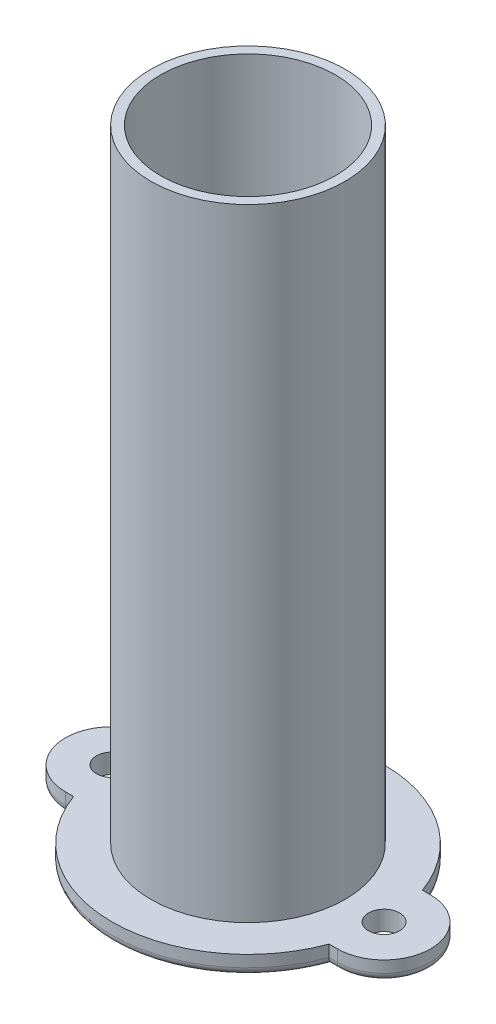
ISO-10303-21;
HEADER;
FILE_DESCRIPTION(('STEP AP214'),'2;1');
FILE_NAME('part.step','',(''),(''),'','','');
FILE_SCHEMA(('AUTOMOTIVE_DESIGN { 1 0 10303 214 1 1 1 1 }'));
ENDSEC;
DATA;
#1=APPLICATION_CONTEXT('core data for automotive mechanical design processes');
#2=APPLICATION_PROTOCOL_DEFINITION('international standard','automotive_design',2000,#1);
#3=PRODUCT_CONTEXT('',#1,'mechanical');
#4=PRODUCT('Part','Part','',(#3));
#5=PRODUCT_RELATED_PRODUCT_CATEGORY('part','',(#4));
#6=PRODUCT_DEFINITION_FORMATION('','',#4);
#7=PRODUCT_DEFINITION_CONTEXT('part definition',#1,'design');
#8=PRODUCT_DEFINITION('design','',#6,#7);
#9=PRODUCT_DEFINITION_SHAPE('','',#8);
#10=(LENGTH_UNIT() NAMED_UNIT(*) SI_UNIT(.MILLI.,.METRE.));
#11=(NAMED_UNIT(*) PLANE_ANGLE_UNIT() SI_UNIT($,.RADIAN.));
#12=(NAMED_UNIT(*) SI_UNIT($,.STERADIAN.) SOLID_ANGLE_UNIT());
#13=UNCERTAINTY_MEASURE_WITH_UNIT(LENGTH_MEASURE(1.E-05),#10,'distance_accuracy_value','');
#14=(GEOMETRIC_REPRESENTATION_CONTEXT(3) GLOBAL_UNCERTAINTY_ASSIGNED_CONTEXT((#13)) GLOBAL_UNIT_ASSIGNED_CONTEXT((#10,
#11,#12)) REPRESENTATION_CONTEXT('',''));
#15=CARTESIAN_POINT('',(0.,0.,0.));
#16=DIRECTION('',(0.,0.,1.));
#17=DIRECTION('',(1.,0.,0.));
#18=AXIS2_PLACEMENT_3D('',#15,#16,#17);
#19=CARTESIAN_POINT('',(-17.5,2.5,0.));
#20=DIRECTION('',(0.,1.,0.));
#21=DIRECTION('',(0.,0.,1.));
#22=AXIS2_PLACEMENT_3D('',#19,#20,#21);
#23=PLANE('',#22);
#24=CARTESIAN_POINT('',(0.,2.5,0.));
#25=DIRECTION('',(0.,1.,0.));
#26=DIRECTION('',(0.,0.,1.));
#27=AXIS2_PLACEMENT_3D('',#24,#25,#26);
#28=CIRCLE('',#27,12.5);
#29=CARTESIAN_POINT('',(0.,2.5,12.5));
#30=VERTEX_POINT('',#29);
#31=EDGE_CURVE('E293',#30,#30,#28,.T.);
#32=ORIENTED_EDGE('',*,*,#31,.F.);
#33=EDGE_LOOP('',(#32));
#34=FACE_BOUND('',#33,.T.);
#35=CARTESIAN_POINT('',(-17.5,2.5,0.));
#36=DIRECTION('',(0.,1.,0.));
#37=DIRECTION('',(0.,0.,1.));
#38=AXIS2_PLACEMENT_3D('',#35,#36,#37);
#39=CIRCLE('',#38,6.);
#40=CARTESIAN_POINT('',(-17.5,2.5,-6.));
#41=VERTEX_POINT('',#40);
#42=CARTESIAN_POINT('',(-17.5,2.5,6.));
#43=VERTEX_POINT('',#42);
#44=EDGE_CURVE('E147',#41,#43,#39,.T.);
#45=ORIENTED_EDGE('',*,*,#44,.T.);
#46=DIRECTION('',(1.,0.,0.));
#47=VECTOR('',#46,1.);
#48=CARTESIAN_POINT('',(-17.5,2.5,6.));
#49=LINE('',#48,#47);
#50=CARTESIAN_POINT('',(-16.4392822227736,2.5,6.));
#51=VERTEX_POINT('',#50);
#52=EDGE_CURVE('E135',#43,#51,#49,.T.);
#53=ORIENTED_EDGE('',*,*,#52,.T.);
#54=CARTESIAN_POINT('',(0.,2.5,0.));
#55=DIRECTION('',(0.,1.,0.));
#56=DIRECTION('',(0.,0.,1.));
#57=AXIS2_PLACEMENT_3D('',#54,#55,#56);
#58=CIRCLE('',#57,17.5);
#59=CARTESIAN_POINT('',(16.4392822227736,2.5,5.99999999999999));
#60=VERTEX_POINT('',#59);
#61=EDGE_CURVE('E146',#51,#60,#58,.T.);
#62=ORIENTED_EDGE('',*,*,#61,.T.);
#63=DIRECTION('',(1.,0.,0.));
#64=VECTOR('',#63,1.);
#65=CARTESIAN_POINT('',(17.5,2.5,5.99999999999999));
#66=LINE('',#65,#64);
#67=CARTESIAN_POINT('',(17.5,2.5,5.99999999999999));
#68=VERTEX_POINT('',#67);
#69=EDGE_CURVE('E351',#60,#68,#66,.T.);
#70=ORIENTED_EDGE('',*,*,#69,.T.);
#71=CARTESIAN_POINT('',(17.5,2.5,0.));
#72=DIRECTION('',(0.,1.,0.));
#73=DIRECTION('',(0.,0.,-1.));
#74=AXIS2_PLACEMENT_3D('',#71,#72,#73);
#75=CIRCLE('',#74,6.);
#76=CARTESIAN_POINT('',(17.5,2.5,-6.));
#77=VERTEX_POINT('',#76);
#78=EDGE_CURVE('E357',#68,#77,#75,.T.);
#79=ORIENTED_EDGE('',*,*,#78,.T.);
#80=DIRECTION('',(-1.,0.,0.));
#81=VECTOR('',#80,1.);
#82=CARTESIAN_POINT('',(17.5,2.5,-6.));
#83=LINE('',#82,#81);
#84=CARTESIAN_POINT('',(16.4392822227736,2.5,-6.));
#85=VERTEX_POINT('',#84);
#86=EDGE_CURVE('E362',#77,#85,#83,.T.);
#87=ORIENTED_EDGE('',*,*,#86,.T.);
#88=CARTESIAN_POINT('',(0.,2.5,0.));
#89=DIRECTION('',(0.,1.,0.));
#90=DIRECTION('',(0.,0.,1.));
#91=AXIS2_PLACEMENT_3D('',#88,#89,#90);
#92=CIRCLE('',#91,17.5);
#93=CARTESIAN_POINT('',(-16.4392822227736,2.5,-6.));
#94=VERTEX_POINT('',#93);
#95=EDGE_CURVE('E365',#85,#94,#92,.T.);
#96=ORIENTED_EDGE('',*,*,#95,.T.);
#97=DIRECTION('',(-1.,0.,0.));
#98=VECTOR('',#97,1.);
#99=CARTESIAN_POINT('',(-17.5,2.5,-6.));
#100=LINE('',#99,#98);
#101=EDGE_CURVE('E152',#94,#41,#100,.T.);
#102=ORIENTED_EDGE('',*,*,#101,.T.);
#103=EDGE_LOOP('',(#45,#53,#62,#70,#79,#87,#96,#102));
#104=FACE_BOUND('',#103,.T.);
#105=CARTESIAN_POINT('',(-17.5,2.5,0.));
#106=DIRECTION('',(0.,1.,0.));
#107=DIRECTION('',(0.,0.,1.));
#108=AXIS2_PLACEMENT_3D('',#105,#106,#107);
#109=CIRCLE('',#108,2.);
#110=CARTESIAN_POINT('',(-17.5,2.5,2.));
#111=VERTEX_POINT('',#110);
#112=EDGE_CURVE('E157',#111,#111,#109,.T.);
#113=ORIENTED_EDGE('',*,*,#112,.F.);
#114=EDGE_LOOP('',(#113));
#115=FACE_BOUND('',#114,.T.);
#116=CARTESIAN_POINT('',(17.5,2.5,0.));
#117=DIRECTION('',(0.,1.,0.));
#118=DIRECTION('',(0.,0.,1.));
#119=AXIS2_PLACEMENT_3D('',#116,#117,#118);
#120=CIRCLE('',#119,2.);
#121=CARTESIAN_POINT('',(17.5,2.5,2.));
#122=VERTEX_POINT('',#121);
#123=EDGE_CURVE('E411',#122,#122,#120,.T.);
#124=ORIENTED_EDGE('',*,*,#123,.F.);
#125=EDGE_LOOP('',(#124));
#126=FACE_BOUND('',#125,.T.);
#127=ADVANCED_FACE('F41',(#34,#104,#115,#126),#23,.T.);
#128=CARTESIAN_POINT('',(-17.5,0.,0.));
#129=DIRECTION('',(0.,1.,0.));
#130=DIRECTION('',(0.,0.,1.));
#131=AXIS2_PLACEMENT_3D('',#128,#129,#130);
#132=PLANE('',#131);
#133=CARTESIAN_POINT('',(0.,0.,0.));
#134=DIRECTION('',(0.,1.,0.));
#135=DIRECTION('',(0.,0.,1.));
#136=AXIS2_PLACEMENT_3D('',#133,#134,#135);
#137=CIRCLE('',#136,12.25);
#138=CARTESIAN_POINT('',(0.,0.,12.25));
#139=VERTEX_POINT('',#138);
#140=EDGE_CURVE('E198',#139,#139,#137,.T.);
#141=ORIENTED_EDGE('',*,*,#140,.T.);
#142=EDGE_LOOP('',(#141));
#143=FACE_BOUND('',#142,.T.);
#144=DIRECTION('',(-1.,0.,0.));
#145=VECTOR('',#144,1.);
#146=CARTESIAN_POINT('',(-17.5,0.,-5.));
#147=LINE('',#146,#145);
#148=CARTESIAN_POINT('',(-17.5,0.,-5.));
#149=VERTEX_POINT('',#148);
#150=CARTESIAN_POINT('',(-15.7241851935164,0.,-5.));
#151=VERTEX_POINT('',#150);
#152=EDGE_CURVE('E191',#149,#151,#147,.F.);
#153=ORIENTED_EDGE('',*,*,#152,.T.);
#154=CARTESIAN_POINT('',(0.,0.,0.));
#155=DIRECTION('',(0.,1.,0.));
#156=DIRECTION('',(0.,0.,1.));
#157=AXIS2_PLACEMENT_3D('',#154,#155,#156);
#158=CIRCLE('',#157,16.5);
#159=CARTESIAN_POINT('',(15.7241851935164,0.,-5.));
#160=VERTEX_POINT('',#159);
#161=EDGE_CURVE('E195',#151,#160,#158,.F.);
#162=ORIENTED_EDGE('',*,*,#161,.T.);
#163=DIRECTION('',(-1.,0.,0.));
#164=VECTOR('',#163,1.);
#165=CARTESIAN_POINT('',(-17.5,0.,-5.));
#166=LINE('',#165,#164);
#167=CARTESIAN_POINT('',(17.5,0.,-5.));
#168=VERTEX_POINT('',#167);
#169=EDGE_CURVE('E188',#160,#168,#166,.F.);
#170=ORIENTED_EDGE('',*,*,#169,.T.);
#171=CARTESIAN_POINT('',(17.5,0.,0.));
#172=DIRECTION('',(0.,1.,0.));
#173=DIRECTION('',(0.,0.,1.));
#174=AXIS2_PLACEMENT_3D('',#171,#172,#173);
#175=CIRCLE('',#174,5.);
#176=CARTESIAN_POINT('',(17.5,0.,4.99999999999999));
#177=VERTEX_POINT('',#176);
#178=EDGE_CURVE('E182',#168,#177,#175,.F.);
#179=ORIENTED_EDGE('',*,*,#178,.T.);
#180=DIRECTION('',(1.,0.,0.));
#181=VECTOR('',#180,1.);
#182=CARTESIAN_POINT('',(-17.5,0.,4.99999999999999));
#183=LINE('',#182,#181);
#184=CARTESIAN_POINT('',(15.7241851935164,0.,4.99999999999999));
#185=VERTEX_POINT('',#184);
#186=EDGE_CURVE('E176',#177,#185,#183,.F.);
#187=ORIENTED_EDGE('',*,*,#186,.T.);
#188=CARTESIAN_POINT('',(0.,0.,0.));
#189=DIRECTION('',(0.,1.,0.));
#190=DIRECTION('',(0.,0.,1.));
#191=AXIS2_PLACEMENT_3D('',#188,#189,#190);
#192=CIRCLE('',#191,16.5);
#193=CARTESIAN_POINT('',(-15.7241851935164,0.,5.));
#194=VERTEX_POINT('',#193);
#195=EDGE_CURVE('E168',#185,#194,#192,.F.);
#196=ORIENTED_EDGE('',*,*,#195,.T.);
#197=DIRECTION('',(1.,0.,0.));
#198=VECTOR('',#197,1.);
#199=CARTESIAN_POINT('',(-17.5,0.,5.));
#200=LINE('',#199,#198);
#201=CARTESIAN_POINT('',(-17.5,0.,5.));
#202=VERTEX_POINT('',#201);
#203=EDGE_CURVE('E179',#194,#202,#200,.F.);
#204=ORIENTED_EDGE('',*,*,#203,.T.);
#205=CARTESIAN_POINT('',(-17.5,0.,0.));
#206=DIRECTION('',(0.,1.,0.));
#207=DIRECTION('',(0.,0.,1.));
#208=AXIS2_PLACEMENT_3D('',#205,#206,#207);
#209=CIRCLE('',#208,5.);
#210=EDGE_CURVE('E185',#202,#149,#209,.F.);
#211=ORIENTED_EDGE('',*,*,#210,.T.);
#212=EDGE_LOOP('',(#153,#162,#170,#179,#187,#196,#204,#211));
#213=FACE_BOUND('',#212,.T.);
#214=CARTESIAN_POINT('',(-17.5,0.,0.));
#215=DIRECTION('',(0.,1.,0.));
#216=DIRECTION('',(0.,0.,1.));
#217=AXIS2_PLACEMENT_3D('',#214,#215,#216);
#218=CIRCLE('',#217,2.);
#219=CARTESIAN_POINT('',(-17.5,0.,2.));
#220=VERTEX_POINT('',#219);
#221=EDGE_CURVE('E409',#220,#220,#218,.T.);
#222=ORIENTED_EDGE('',*,*,#221,.T.);
#223=EDGE_LOOP('',(#222));
#224=FACE_BOUND('',#223,.T.);
#225=CARTESIAN_POINT('',(17.5,0.,0.));
#226=DIRECTION('',(0.,1.,0.));
#227=DIRECTION('',(0.,0.,1.));
#228=AXIS2_PLACEMENT_3D('',#225,#226,#227);
#229=CIRCLE('',#228,2.);
#230=CARTESIAN_POINT('',(17.5,0.,2.));
#231=VERTEX_POINT('',#230);
#232=EDGE_CURVE('E417',#231,#231,#229,.T.);
#233=ORIENTED_EDGE('',*,*,#232,.T.);
#234=EDGE_LOOP('',(#233));
#235=FACE_BOUND('',#234,.T.);
#236=ADVANCED_FACE('F303',(#143,#213,#224,#235),#132,.F.);
#237=CARTESIAN_POINT('',(-17.5,2.5,0.));
#238=DIRECTION('',(0.,-1.,0.));
#239=DIRECTION('',(0.,0.,-1.));
#240=AXIS2_PLACEMENT_3D('',#237,#238,#239);
#241=CYLINDRICAL_SURFACE('',#240,6.);
#242=DIRECTION('',(0.,-1.,0.));
#243=VECTOR('',#242,1.);
#244=CARTESIAN_POINT('',(-17.5,2.5,-6.));
#245=LINE('',#244,#243);
#246=CARTESIAN_POINT('',(-17.5,1.,-6.));
#247=VERTEX_POINT('',#246);
#248=EDGE_CURVE('E331',#41,#247,#245,.T.);
#249=ORIENTED_EDGE('',*,*,#248,.T.);
#250=CARTESIAN_POINT('',(-17.5,1.,0.));
#251=DIRECTION('',(0.,1.,0.));
#252=DIRECTION('',(0.,0.,1.));
#253=AXIS2_PLACEMENT_3D('',#250,#251,#252);
#254=CIRCLE('',#253,6.);
#255=CARTESIAN_POINT('',(-17.5,1.,6.));
#256=VERTEX_POINT('',#255);
#257=EDGE_CURVE('E161',#247,#256,#254,.T.);
#258=ORIENTED_EDGE('',*,*,#257,.T.);
#259=DIRECTION('',(0.,-1.,0.));
#260=VECTOR('',#259,1.);
#261=CARTESIAN_POINT('',(-17.5,2.5,6.));
#262=LINE('',#261,#260);
#263=EDGE_CURVE('E139',#43,#256,#262,.T.);
#264=ORIENTED_EDGE('',*,*,#263,.F.);
#265=ORIENTED_EDGE('',*,*,#44,.F.);
#266=EDGE_LOOP('',(#249,#258,#264,#265));
#267=FACE_BOUND('',#266,.T.);
#268=ADVANCED_FACE('F159',(#267),#241,.T.);
#269=CARTESIAN_POINT('',(-17.5,2.5,6.));
#270=DIRECTION('',(0.,0.,-1.));
#271=DIRECTION('',(-1.,0.,0.));
#272=AXIS2_PLACEMENT_3D('',#269,#270,#271);
#273=PLANE('',#272);
#274=ORIENTED_EDGE('',*,*,#263,.T.);
#275=DIRECTION('',(1.,0.,0.));
#276=VECTOR('',#275,1.);
#277=CARTESIAN_POINT('',(-17.5,1.,6.));
#278=LINE('',#277,#276);
#279=CARTESIAN_POINT('',(-16.4392822227736,1.,6.));
#280=VERTEX_POINT('',#279);
#281=EDGE_CURVE('E202',#256,#280,#278,.T.);
#282=ORIENTED_EDGE('',*,*,#281,.T.);
#283=DIRECTION('',(0.,-1.,0.));
#284=VECTOR('',#283,1.);
#285=CARTESIAN_POINT('',(-16.4392822227736,2.5,6.));
#286=LINE('',#285,#284);
#287=EDGE_CURVE('E142',#51,#280,#286,.T.);
#288=ORIENTED_EDGE('',*,*,#287,.F.);
#289=ORIENTED_EDGE('',*,*,#52,.F.);
#290=EDGE_LOOP('',(#274,#282,#288,#289));
#291=FACE_BOUND('',#290,.T.);
#292=ADVANCED_FACE('F137',(#291),#273,.F.);
#293=CARTESIAN_POINT('',(0.,2.5,0.));
#294=DIRECTION('',(0.,-1.,0.));
#295=DIRECTION('',(0.,0.,-1.));
#296=AXIS2_PLACEMENT_3D('',#293,#294,#295);
#297=CYLINDRICAL_SURFACE('',#296,17.5);
#298=ORIENTED_EDGE('',*,*,#287,.T.);
#299=CARTESIAN_POINT('',(0.,1.,0.));
#300=DIRECTION('',(0.,1.,0.));
#301=DIRECTION('',(0.,0.,1.));
#302=AXIS2_PLACEMENT_3D('',#299,#300,#301);
#303=CIRCLE('',#302,17.5);
#304=CARTESIAN_POINT('',(16.4392822227736,1.,5.99999999999999));
#305=VERTEX_POINT('',#304);
#306=EDGE_CURVE('E11',#280,#305,#303,.T.);
#307=ORIENTED_EDGE('',*,*,#306,.T.);
#308=DIRECTION('',(0.,-1.,0.));
#309=VECTOR('',#308,1.);
#310=CARTESIAN_POINT('',(16.4392822227736,2.5,5.99999999999999));
#311=LINE('',#310,#309);
#312=EDGE_CURVE('E170',#60,#305,#311,.T.);
#313=ORIENTED_EDGE('',*,*,#312,.F.);
#314=ORIENTED_EDGE('',*,*,#61,.F.);
#315=EDGE_LOOP('',(#298,#307,#313,#314));
#316=FACE_BOUND('',#315,.T.);
#317=ADVANCED_FACE('F353',(#316),#297,.T.);
#318=CARTESIAN_POINT('',(17.5,2.5,5.99999999999999));
#319=DIRECTION('',(0.,0.,-1.));
#320=DIRECTION('',(-1.,0.,0.));
#321=AXIS2_PLACEMENT_3D('',#318,#319,#320);
#322=PLANE('',#321);
#323=ORIENTED_EDGE('',*,*,#312,.T.);
#324=DIRECTION('',(1.,0.,0.));
#325=VECTOR('',#324,1.);
#326=CARTESIAN_POINT('',(17.5,1.,5.99999999999999));
#327=LINE('',#326,#325);
#328=CARTESIAN_POINT('',(17.5,1.,5.99999999999999));
#329=VERTEX_POINT('',#328);
#330=EDGE_CURVE('E205',#305,#329,#327,.T.);
#331=ORIENTED_EDGE('',*,*,#330,.T.);
#332=DIRECTION('',(0.,-1.,0.));
#333=VECTOR('',#332,1.);
#334=CARTESIAN_POINT('',(17.5,2.5,5.99999999999999));
#335=LINE('',#334,#333);
#336=EDGE_CURVE('E342',#68,#329,#335,.T.);
#337=ORIENTED_EDGE('',*,*,#336,.F.);
#338=ORIENTED_EDGE('',*,*,#69,.F.);
#339=EDGE_LOOP('',(#323,#331,#337,#338));
#340=FACE_BOUND('',#339,.T.);
#341=ADVANCED_FACE('F349',(#340),#322,.F.);
#342=CARTESIAN_POINT('',(17.5,2.5,0.));
#343=DIRECTION('',(0.,-1.,0.));
#344=DIRECTION('',(0.,0.,-1.));
#345=AXIS2_PLACEMENT_3D('',#342,#343,#344);
#346=CYLINDRICAL_SURFACE('',#345,6.);
#347=ORIENTED_EDGE('',*,*,#336,.T.);
#348=CARTESIAN_POINT('',(17.5,1.,0.));
#349=DIRECTION('',(0.,1.,0.));
#350=DIRECTION('',(0.,0.,1.));
#351=AXIS2_PLACEMENT_3D('',#348,#349,#350);
#352=CIRCLE('',#351,6.);
#353=CARTESIAN_POINT('',(17.5,1.,-6.));
#354=VERTEX_POINT('',#353);
#355=EDGE_CURVE('E59',#329,#354,#352,.T.);
#356=ORIENTED_EDGE('',*,*,#355,.T.);
#357=DIRECTION('',(0.,-1.,0.));
#358=VECTOR('',#357,1.);
#359=CARTESIAN_POINT('',(17.5,2.5,-6.));
#360=LINE('',#359,#358);
#361=EDGE_CURVE('E335',#77,#354,#360,.T.);
#362=ORIENTED_EDGE('',*,*,#361,.F.);
#363=ORIENTED_EDGE('',*,*,#78,.F.);
#364=EDGE_LOOP('',(#347,#356,#362,#363));
#365=FACE_BOUND('',#364,.T.);
#366=ADVANCED_FACE('F372',(#365),#346,.T.);
#367=CARTESIAN_POINT('',(17.5,2.5,-6.));
#368=DIRECTION('',(0.,0.,1.));
#369=DIRECTION('',(1.,0.,0.));
#370=AXIS2_PLACEMENT_3D('',#367,#368,#369);
#371=PLANE('',#370);
#372=ORIENTED_EDGE('',*,*,#361,.T.);
#373=DIRECTION('',(-1.,0.,0.));
#374=VECTOR('',#373,1.);
#375=CARTESIAN_POINT('',(17.5,1.,-6.));
#376=LINE('',#375,#374);
#377=CARTESIAN_POINT('',(16.4392822227736,1.,-6.));
#378=VERTEX_POINT('',#377);
#379=EDGE_CURVE('E66',#354,#378,#376,.T.);
#380=ORIENTED_EDGE('',*,*,#379,.T.);
#381=DIRECTION('',(0.,-1.,0.));
#382=VECTOR('',#381,1.);
#383=CARTESIAN_POINT('',(16.4392822227736,2.5,-6.));
#384=LINE('',#383,#382);
#385=EDGE_CURVE('E327',#85,#378,#384,.T.);
#386=ORIENTED_EDGE('',*,*,#385,.F.);
#387=ORIENTED_EDGE('',*,*,#86,.F.);
#388=EDGE_LOOP('',(#372,#380,#386,#387));
#389=FACE_BOUND('',#388,.T.);
#390=ADVANCED_FACE('F370',(#389),#371,.F.);
#391=CARTESIAN_POINT('',(0.,2.5,0.));
#392=DIRECTION('',(0.,-1.,0.));
#393=DIRECTION('',(0.,0.,-1.));
#394=AXIS2_PLACEMENT_3D('',#391,#392,#393);
#395=CYLINDRICAL_SURFACE('',#394,17.5);
#396=ORIENTED_EDGE('',*,*,#385,.T.);
#397=CARTESIAN_POINT('',(0.,1.,0.));
#398=DIRECTION('',(0.,1.,0.));
#399=DIRECTION('',(0.,0.,1.));
#400=AXIS2_PLACEMENT_3D('',#397,#398,#399);
#401=CIRCLE('',#400,17.5);
#402=CARTESIAN_POINT('',(-16.4392822227736,1.,-6.));
#403=VERTEX_POINT('',#402);
#404=EDGE_CURVE('E51',#378,#403,#401,.T.);
#405=ORIENTED_EDGE('',*,*,#404,.T.);
#406=DIRECTION('',(0.,-1.,0.));
#407=VECTOR('',#406,1.);
#408=CARTESIAN_POINT('',(-16.4392822227736,2.5,-6.));
#409=LINE('',#408,#407);
#410=EDGE_CURVE('E326',#94,#403,#409,.T.);
#411=ORIENTED_EDGE('',*,*,#410,.F.);
#412=ORIENTED_EDGE('',*,*,#95,.F.);
#413=EDGE_LOOP('',(#396,#405,#411,#412));
#414=FACE_BOUND('',#413,.T.);
#415=ADVANCED_FACE('F324',(#414),#395,.T.);
#416=CARTESIAN_POINT('',(-17.5,2.5,-6.));
#417=DIRECTION('',(0.,0.,1.));
#418=DIRECTION('',(1.,0.,0.));
#419=AXIS2_PLACEMENT_3D('',#416,#417,#418);
#420=PLANE('',#419);
#421=ORIENTED_EDGE('',*,*,#410,.T.);
#422=DIRECTION('',(-1.,0.,0.));
#423=VECTOR('',#422,1.);
#424=CARTESIAN_POINT('',(-17.5,1.,-6.));
#425=LINE('',#424,#423);
#426=EDGE_CURVE('E163',#403,#247,#425,.T.);
#427=ORIENTED_EDGE('',*,*,#426,.T.);
#428=ORIENTED_EDGE('',*,*,#248,.F.);
#429=ORIENTED_EDGE('',*,*,#101,.F.);
#430=EDGE_LOOP('',(#421,#427,#428,#429));
#431=FACE_BOUND('',#430,.T.);
#432=ADVANCED_FACE('F329',(#431),#420,.F.);
#433=CARTESIAN_POINT('',(-17.5,2.5,0.));
#434=DIRECTION('',(0.,-1.,0.));
#435=DIRECTION('',(0.,0.,-1.));
#436=AXIS2_PLACEMENT_3D('',#433,#434,#435);
#437=CYLINDRICAL_SURFACE('',#436,2.);
#438=ORIENTED_EDGE('',*,*,#112,.T.);
#439=EDGE_LOOP('',(#438));
#440=FACE_BOUND('',#439,.T.);
#441=ORIENTED_EDGE('',*,*,#221,.F.);
#442=EDGE_LOOP('',(#441));
#443=FACE_BOUND('',#442,.T.);
#444=ADVANCED_FACE('F390',(#440,#443),#437,.F.);
#445=CARTESIAN_POINT('',(0.,2.5,0.));
#446=DIRECTION('',(0.,-1.,0.));
#447=DIRECTION('',(0.,0.,-1.));
#448=AXIS2_PLACEMENT_3D('',#445,#446,#447);
#449=CYLINDRICAL_SURFACE('',#448,11.25);
#450=CARTESIAN_POINT('',(0.,1.,0.));
#451=DIRECTION('',(0.,1.,0.));
#452=DIRECTION('',(0.,0.,1.));
#453=AXIS2_PLACEMENT_3D('',#450,#451,#452);
#454=CIRCLE('',#453,11.25);
#455=CARTESIAN_POINT('',(0.,1.,11.25));
#456=VERTEX_POINT('',#455);
#457=EDGE_CURVE('E210',#456,#456,#454,.F.);
#458=ORIENTED_EDGE('',*,*,#457,.T.);
#459=EDGE_LOOP('',(#458));
#460=FACE_BOUND('',#459,.T.);
#461=CARTESIAN_POINT('',(0.,82.5,0.));
#462=DIRECTION('',(0.,1.,0.));
#463=DIRECTION('',(0.,0.,1.));
#464=AXIS2_PLACEMENT_3D('',#461,#462,#463);
#465=CIRCLE('',#464,11.25);
#466=CARTESIAN_POINT('',(0.,82.5,11.25));
#467=VERTEX_POINT('',#466);
#468=EDGE_CURVE('E427',#467,#467,#465,.F.);
#469=ORIENTED_EDGE('',*,*,#468,.F.);
#470=EDGE_LOOP('',(#469));
#471=FACE_BOUND('',#470,.T.);
#472=ADVANCED_FACE('F397',(#460,#471),#449,.F.);
#473=CARTESIAN_POINT('',(17.5,2.5,0.));
#474=DIRECTION('',(0.,-1.,0.));
#475=DIRECTION('',(0.,0.,-1.));
#476=AXIS2_PLACEMENT_3D('',#473,#474,#475);
#477=CYLINDRICAL_SURFACE('',#476,2.);
#478=ORIENTED_EDGE('',*,*,#123,.T.);
#479=EDGE_LOOP('',(#478));
#480=FACE_BOUND('',#479,.T.);
#481=ORIENTED_EDGE('',*,*,#232,.F.);
#482=EDGE_LOOP('',(#481));
#483=FACE_BOUND('',#482,.T.);
#484=ADVANCED_FACE('F402',(#480,#483),#477,.F.);
#485=CARTESIAN_POINT('',(0.,82.5,0.));
#486=DIRECTION('',(0.,-1.,0.));
#487=DIRECTION('',(0.,0.,-1.));
#488=AXIS2_PLACEMENT_3D('',#485,#486,#487);
#489=CYLINDRICAL_SURFACE('',#488,12.5);
#490=CARTESIAN_POINT('',(0.,82.5,0.));
#491=DIRECTION('',(0.,1.,0.));
#492=DIRECTION('',(0.,0.,1.));
#493=AXIS2_PLACEMENT_3D('',#490,#491,#492);
#494=CIRCLE('',#493,12.5);
#495=CARTESIAN_POINT('',(0.,82.5,12.5));
#496=VERTEX_POINT('',#495);
#497=EDGE_CURVE('E422',#496,#496,#494,.T.);
#498=ORIENTED_EDGE('',*,*,#497,.F.);
#499=EDGE_LOOP('',(#498));
#500=FACE_BOUND('',#499,.T.);
#501=ORIENTED_EDGE('',*,*,#31,.T.);
#502=EDGE_LOOP('',(#501));
#503=FACE_BOUND('',#502,.T.);
#504=ADVANCED_FACE('F439',(#500,#503),#489,.T.);
#505=CARTESIAN_POINT('',(0.,82.5,0.));
#506=DIRECTION('',(0.,1.,0.));
#507=DIRECTION('',(0.,0.,1.));
#508=AXIS2_PLACEMENT_3D('',#505,#506,#507);
#509=PLANE('',#508);
#510=ORIENTED_EDGE('',*,*,#468,.T.);
#511=EDGE_LOOP('',(#510));
#512=FACE_BOUND('',#511,.T.);
#513=ORIENTED_EDGE('',*,*,#497,.T.);
#514=EDGE_LOOP('',(#513));
#515=FACE_BOUND('',#514,.T.);
#516=ADVANCED_FACE('F435',(#512,#515),#509,.T.);
#517=CARTESIAN_POINT('',(17.5,1.,4.99999999999999));
#518=DIRECTION('',(1.,0.,0.));
#519=DIRECTION('',(0.,0.,-1.));
#520=AXIS2_PLACEMENT_3D('',#517,#518,#519);
#521=CYLINDRICAL_SURFACE('',#520,1.);
#522=CARTESIAN_POINT('',(16.4392822227736,1.,5.99999999999999));
#523=CARTESIAN_POINT('',(16.4392834948972,0.975498838751135,6.00000198937388));
#524=CARTESIAN_POINT('',(16.4386518142724,0.951010995516537,5.9990988131598));
#525=CARTESIAN_POINT('',(16.4361411675762,0.902241015393379,5.99551017810501));
#526=CARTESIAN_POINT('',(16.4342627398365,0.877958794300444,5.99282548850224));
#527=CARTESIAN_POINT('',(16.4268151678818,0.805954485258245,5.98218394446621));
#528=CARTESIAN_POINT('',(16.4194332048623,0.758768470909736,5.97163882406712));
#529=CARTESIAN_POINT('',(16.4002413452039,0.667334875289626,5.9442532969744));
#530=CARTESIAN_POINT('',(16.3884372150154,0.623083555280177,5.92742108864916));
#531=CARTESIAN_POINT('',(16.3609495375081,0.538332491991348,5.88828179461849));
#532=CARTESIAN_POINT('',(16.345261614563,0.497837051453815,5.86596853397646));
#533=CARTESIAN_POINT('',(16.3095168292379,0.418824419064257,5.81521742513452));
#534=CARTESIAN_POINT('',(16.2892447517195,0.380599282339374,5.78647919123524));
#535=CARTESIAN_POINT('',(16.2457214633038,0.30955546806992,5.72491269159065));
#536=CARTESIAN_POINT('',(16.2224695033345,0.276738154682045,5.69208339750697));
#537=CARTESIAN_POINT('',(16.1694246715567,0.211509045649656,5.61736858830803));
#538=CARTESIAN_POINT('',(16.1391935418545,0.18012889452447,5.57489492447958));
#539=CARTESIAN_POINT('',(16.0763419874425,0.124973953900242,5.48686006322667));
#540=CARTESIAN_POINT('',(16.043718944096,0.10120765746665,5.44129548611618));
#541=CARTESIAN_POINT('',(15.9705637249168,0.0574538731335491,5.33944922273472));
#542=CARTESIAN_POINT('',(15.9296916276518,0.0389990508207805,5.28275426636287));
#543=CARTESIAN_POINT('',(15.8466563034409,0.0124657530438477,5.1680345995769));
#544=CARTESIAN_POINT('',(15.8044951360003,0.00437152952516765,5.11001204409096));
#545=CARTESIAN_POINT('',(15.750776461794,0.000540340023783553,5.03638386176304));
#546=CARTESIAN_POINT('',(15.7393976743357,9.51107138873768E-05,5.02080475446121));
#547=CARTESIAN_POINT('',(15.7267348049204,4.55968478441578E-06,5.00348634832636));
#548=CARTESIAN_POINT('',(15.7254600553185,2.24208715176137E-09,5.00174314518339));
#549=CARTESIAN_POINT('',(15.7241851935164,0.,4.99999999999999));
#550=B_SPLINE_CURVE_WITH_KNOTS('',3,(#522,#523,#524,#525,#526,#527,#528,#529,#530,#531,#532,
#533,#534,#535,#536,#537,#538,#539,#540,#541,#542,#543,#544,#545,#546,#547,#548,#549),
.UNSPECIFIED.,.F.,.F.,(4,2,2,2,2,2,2,2,2,2,2,2,2,4),(0.,0.0734529793315331,0.146874263091895,
0.292810988700288,0.438558073312089,0.584470115330727,0.73971192502026,0.894992835661163,
1.07686267678643,1.25893468846582,1.47498145167053,1.69069943346762,1.74858374273921,
1.75506245751771),.UNSPECIFIED.);
#551=EDGE_CURVE('E280',#185,#305,#550,.F.);
#552=ORIENTED_EDGE('',*,*,#551,.F.);
#553=ORIENTED_EDGE('',*,*,#186,.F.);
#554=CARTESIAN_POINT('',(17.5,1.,4.99999999999999));
#555=DIRECTION('',(1.,0.,0.));
#556=DIRECTION('',(0.,0.,-1.));
#557=AXIS2_PLACEMENT_3D('',#554,#555,#556);
#558=CIRCLE('',#557,1.);
#559=EDGE_CURVE('E45',#329,#177,#558,.T.);
#560=ORIENTED_EDGE('',*,*,#559,.F.);
#561=ORIENTED_EDGE('',*,*,#330,.F.);
#562=EDGE_LOOP('',(#552,#553,#560,#561));
#563=FACE_BOUND('',#562,.T.);
#564=ADVANCED_FACE('F277',(#563),#521,.T.);
#565=CARTESIAN_POINT('',(17.5,1.,0.));
#566=DIRECTION('',(0.,1.,0.));
#567=DIRECTION('',(0.,0.,1.));
#568=AXIS2_PLACEMENT_3D('',#565,#566,#567);
#569=TOROIDAL_SURFACE('',#568,5.,1.);
#570=ORIENTED_EDGE('',*,*,#559,.T.);
#571=ORIENTED_EDGE('',*,*,#178,.F.);
#572=CARTESIAN_POINT('',(17.5,1.,-5.));
#573=DIRECTION('',(-1.,0.,0.));
#574=DIRECTION('',(0.,0.,1.));
#575=AXIS2_PLACEMENT_3D('',#572,#573,#574);
#576=CIRCLE('',#575,1.);
#577=EDGE_CURVE('E271',#354,#168,#576,.T.);
#578=ORIENTED_EDGE('',*,*,#577,.F.);
#579=ORIENTED_EDGE('',*,*,#355,.F.);
#580=EDGE_LOOP('',(#570,#571,#578,#579));
#581=FACE_BOUND('',#580,.T.);
#582=ADVANCED_FACE('F275',(#581),#569,.T.);
#583=CARTESIAN_POINT('',(0.,1.,0.));
#584=DIRECTION('',(0.,1.,0.));
#585=DIRECTION('',(0.,0.,1.));
#586=AXIS2_PLACEMENT_3D('',#583,#584,#585);
#587=TOROIDAL_SURFACE('',#586,16.5,1.);
#588=ORIENTED_EDGE('',*,*,#551,.T.);
#589=ORIENTED_EDGE('',*,*,#306,.F.);
#590=CARTESIAN_POINT('',(-16.4392822227736,1.,6.));
#591=CARTESIAN_POINT('',(-16.4392834948972,0.975498838751135,6.00000198937388));
#592=CARTESIAN_POINT('',(-16.4386518142724,0.951010995516537,5.99909881315981));
#593=CARTESIAN_POINT('',(-16.4361411675762,0.902241015393379,5.99551017810502));
#594=CARTESIAN_POINT('',(-16.4342627398365,0.877958794300445,5.99282548850224));
#595=CARTESIAN_POINT('',(-16.4268151678818,0.805954485258245,5.98218394446622));
#596=CARTESIAN_POINT('',(-16.4194332048623,0.758768470909736,5.97163882406713));
#597=CARTESIAN_POINT('',(-16.4002413452039,0.667334875289626,5.94425329697441));
#598=CARTESIAN_POINT('',(-16.3884372150154,0.623083555280176,5.92742108864917));
#599=CARTESIAN_POINT('',(-16.3609495375081,0.538332491991347,5.88828179461849));
#600=CARTESIAN_POINT('',(-16.3452616145631,0.497837051453813,5.86596853397646));
#601=CARTESIAN_POINT('',(-16.309516829238,0.418824419064255,5.81521742513452));
#602=CARTESIAN_POINT('',(-16.2892447517195,0.380599282339374,5.78647919123524));
#603=CARTESIAN_POINT('',(-16.2457214633038,0.309555468069921,5.72491269159066));
#604=CARTESIAN_POINT('',(-16.2224695033345,0.276738154682045,5.69208339750698));
#605=CARTESIAN_POINT('',(-16.1694246715567,0.211509045649656,5.61736858830804));
#606=CARTESIAN_POINT('',(-16.1391935418545,0.18012889452447,5.57489492447959));
#607=CARTESIAN_POINT('',(-16.0763419874425,0.124973953900242,5.48686006322668));
#608=CARTESIAN_POINT('',(-16.043718944096,0.10120765746665,5.44129548611618));
#609=CARTESIAN_POINT('',(-15.9705637249168,0.0574538731335486,5.33944922273473));
#610=CARTESIAN_POINT('',(-15.9296916276518,0.0389990508207803,5.28275426636288));
#611=CARTESIAN_POINT('',(-15.8466563034409,0.0124657530438475,5.16803459957691));
#612=CARTESIAN_POINT('',(-15.8044951360003,0.0043715295251673,5.11001204409097));
#613=CARTESIAN_POINT('',(-15.750776461794,0.000540340023783705,5.03638386176305));
#614=CARTESIAN_POINT('',(-15.7393976743357,9.51107138876648E-05,5.02080475446122));
#615=CARTESIAN_POINT('',(-15.7267348049204,4.55968478447294E-06,5.00348634832637));
#616=CARTESIAN_POINT('',(-15.7254600553185,2.24208718163564E-09,5.0017431451834));
#617=CARTESIAN_POINT('',(-15.7241851935164,0.,5.));
#618=B_SPLINE_CURVE_WITH_KNOTS('',3,(#590,#591,#592,#593,#594,#595,#596,#597,#598,#599,#600,
#601,#602,#603,#604,#605,#606,#607,#608,#609,#610,#611,#612,#613,#614,#615,#616,#617),
.UNSPECIFIED.,.F.,.F.,(4,2,2,2,2,2,2,2,2,2,2,2,2,4),(0.,0.0734529793315332,0.146874263091894,
0.292810988700288,0.438558073312089,0.584470115330726,0.739711925020261,0.894992835661164,
1.07686267678643,1.25893468846582,1.47498145167053,1.69069943346762,1.74858374273921,
1.75506245751771),.UNSPECIFIED.);
#619=EDGE_CURVE('E263',#194,#280,#618,.F.);
#620=ORIENTED_EDGE('',*,*,#619,.F.);
#621=ORIENTED_EDGE('',*,*,#195,.F.);
#622=EDGE_LOOP('',(#588,#589,#620,#621));
#623=FACE_BOUND('',#622,.T.);
#624=ADVANCED_FACE('F251',(#623),#587,.T.);
#625=CARTESIAN_POINT('',(17.5,1.,-5.));
#626=DIRECTION('',(-1.,0.,0.));
#627=DIRECTION('',(0.,0.,1.));
#628=AXIS2_PLACEMENT_3D('',#625,#626,#627);
#629=CYLINDRICAL_SURFACE('',#628,1.);
#630=ORIENTED_EDGE('',*,*,#577,.T.);
#631=ORIENTED_EDGE('',*,*,#169,.F.);
#632=CARTESIAN_POINT('',(16.4392822227736,1.,-6.));
#633=CARTESIAN_POINT('',(16.4392834948972,0.975498838751135,-6.00000198937389));
#634=CARTESIAN_POINT('',(16.4386518142724,0.951010995516537,-5.99909881315981));
#635=CARTESIAN_POINT('',(16.4361411675762,0.90224101539338,-5.99551017810502));
#636=CARTESIAN_POINT('',(16.4342627398365,0.877958794300445,-5.99282548850225));
#637=CARTESIAN_POINT('',(16.4268151678818,0.805954485258246,-5.98218394446622));
#638=CARTESIAN_POINT('',(16.4194332048623,0.758768470909736,-5.97163882406713));
#639=CARTESIAN_POINT('',(16.4002413452039,0.667334875289626,-5.94425329697441));
#640=CARTESIAN_POINT('',(16.3884372150154,0.623083555280178,-5.92742108864917));
#641=CARTESIAN_POINT('',(16.3609495375081,0.538332491991349,-5.8882817946185));
#642=CARTESIAN_POINT('',(16.3452616145631,0.497837051453816,-5.86596853397647));
#643=CARTESIAN_POINT('',(16.309516829238,0.418824419064257,-5.81521742513453));
#644=CARTESIAN_POINT('',(16.2892447517195,0.380599282339374,-5.78647919123525));
#645=CARTESIAN_POINT('',(16.2457214633038,0.309555468069921,-5.72491269159066));
#646=CARTESIAN_POINT('',(16.2224695033345,0.276738154682046,-5.69208339750698));
#647=CARTESIAN_POINT('',(16.1694246715567,0.211509045649657,-5.61736858830805));
#648=CARTESIAN_POINT('',(16.1391935418545,0.180128894524471,-5.57489492447959));
#649=CARTESIAN_POINT('',(16.0763419874425,0.124973953900243,-5.48686006322668));
#650=CARTESIAN_POINT('',(16.043718944096,0.10120765746665,-5.44129548611619));
#651=CARTESIAN_POINT('',(15.9705637249168,0.0574538731335495,-5.33944922273473));
#652=CARTESIAN_POINT('',(15.9296916276518,0.0389990508207808,-5.28275426636288));
#653=CARTESIAN_POINT('',(15.8466563034409,0.0124657530438477,-5.16803459957691));
#654=CARTESIAN_POINT('',(15.8044951360003,0.00437152952516762,-5.11001204409096));
#655=CARTESIAN_POINT('',(15.750776461794,0.000540340023783866,-5.03638386176306));
#656=CARTESIAN_POINT('',(15.7393976743357,9.51107138877859E-05,-5.02080475446124));
#657=CARTESIAN_POINT('',(15.7267348049204,4.55968478449526E-06,-5.00348634832637));
#658=CARTESIAN_POINT('',(15.7254600553185,2.24208719334299E-09,-5.0017431451834));
#659=CARTESIAN_POINT('',(15.7241851935164,0.,-5.));
#660=B_SPLINE_CURVE_WITH_KNOTS('',3,(#632,#633,#634,#635,#636,#637,#638,#639,#640,#641,#642,
#643,#644,#645,#646,#647,#648,#649,#650,#651,#652,#653,#654,#655,#656,#657,#658,#659),
.UNSPECIFIED.,.F.,.F.,(4,2,2,2,2,2,2,2,2,2,2,2,2,4),(0.,0.0734529793315327,0.146874263091894,
0.292810988700288,0.438558073312088,0.584470115330725,0.73971192502026,0.894992835661162,
1.07686267678643,1.25893468846582,1.47498145167053,1.69069943346762,1.74858374273921,
1.75506245751771),.UNSPECIFIED.);
#661=EDGE_CURVE('E255',#378,#160,#660,.T.);
#662=ORIENTED_EDGE('',*,*,#661,.F.);
#663=ORIENTED_EDGE('',*,*,#379,.F.);
#664=EDGE_LOOP('',(#630,#631,#662,#663));
#665=FACE_BOUND('',#664,.T.);
#666=ADVANCED_FACE('F246',(#665),#629,.T.);
#667=CARTESIAN_POINT('',(-17.5,1.,5.));
#668=DIRECTION('',(1.,0.,0.));
#669=DIRECTION('',(0.,0.,-1.));
#670=AXIS2_PLACEMENT_3D('',#667,#668,#669);
#671=CYLINDRICAL_SURFACE('',#670,1.);
#672=ORIENTED_EDGE('',*,*,#619,.T.);
#673=ORIENTED_EDGE('',*,*,#281,.F.);
#674=CARTESIAN_POINT('',(-17.5,1.,5.));
#675=DIRECTION('',(-1.,0.,0.));
#676=DIRECTION('',(0.,0.,1.));
#677=AXIS2_PLACEMENT_3D('',#674,#675,#676);
#678=CIRCLE('',#677,1.);
#679=EDGE_CURVE('E232',#202,#256,#678,.T.);
#680=ORIENTED_EDGE('',*,*,#679,.F.);
#681=ORIENTED_EDGE('',*,*,#203,.F.);
#682=EDGE_LOOP('',(#672,#673,#680,#681));
#683=FACE_BOUND('',#682,.T.);
#684=ADVANCED_FACE('F250',(#683),#671,.T.);
#685=CARTESIAN_POINT('',(0.,1.,0.));
#686=DIRECTION('',(0.,1.,0.));
#687=DIRECTION('',(0.,0.,1.));
#688=AXIS2_PLACEMENT_3D('',#685,#686,#687);
#689=TOROIDAL_SURFACE('',#688,16.5,1.);
#690=ORIENTED_EDGE('',*,*,#661,.T.);
#691=ORIENTED_EDGE('',*,*,#161,.F.);
#692=CARTESIAN_POINT('',(-16.4392822227736,1.,-6.));
#693=CARTESIAN_POINT('',(-16.4392834948972,0.975498838751135,-6.00000198937388));
#694=CARTESIAN_POINT('',(-16.4386518142724,0.951010995516537,-5.99909881315981));
#695=CARTESIAN_POINT('',(-16.4361411675762,0.902241015393379,-5.99551017810502));
#696=CARTESIAN_POINT('',(-16.4342627398365,0.877958794300445,-5.99282548850224));
#697=CARTESIAN_POINT('',(-16.4268151678818,0.805954485258245,-5.98218394446622));
#698=CARTESIAN_POINT('',(-16.4194332048623,0.758768470909736,-5.97163882406713));
#699=CARTESIAN_POINT('',(-16.4002413452039,0.667334875289626,-5.94425329697441));
#700=CARTESIAN_POINT('',(-16.3884372150154,0.623083555280177,-5.92742108864917));
#701=CARTESIAN_POINT('',(-16.3609495375081,0.538332491991349,-5.8882817946185));
#702=CARTESIAN_POINT('',(-16.3452616145631,0.497837051453815,-5.86596853397646));
#703=CARTESIAN_POINT('',(-16.309516829238,0.418824419064257,-5.81521742513452));
#704=CARTESIAN_POINT('',(-16.2892447517195,0.380599282339375,-5.78647919123524));
#705=CARTESIAN_POINT('',(-16.2457214633038,0.309555468069921,-5.72491269159066));
#706=CARTESIAN_POINT('',(-16.2224695033345,0.276738154682046,-5.69208339750698));
#707=CARTESIAN_POINT('',(-16.1694246715567,0.211509045649657,-5.61736858830804));
#708=CARTESIAN_POINT('',(-16.1391935418545,0.180128894524471,-5.57489492447959));
#709=CARTESIAN_POINT('',(-16.0763419874425,0.124973953900243,-5.48686006322668));
#710=CARTESIAN_POINT('',(-16.043718944096,0.10120765746665,-5.44129548611618));
#711=CARTESIAN_POINT('',(-15.9705637249168,0.0574538731335491,-5.33944922273473));
#712=CARTESIAN_POINT('',(-15.9296916276518,0.038999050820781,-5.28275426636288));
#713=CARTESIAN_POINT('',(-15.8466563034409,0.012465753043848,-5.16803459957691));
#714=CARTESIAN_POINT('',(-15.8044951360003,0.00437152952516747,-5.11001204409096));
#715=CARTESIAN_POINT('',(-15.750776461794,0.00054034002378389,-5.03638386176305));
#716=CARTESIAN_POINT('',(-15.7393976743357,9.51107138878845E-05,-5.02080475446123));
#717=CARTESIAN_POINT('',(-15.7267348049204,4.55968478451747E-06,-5.00348634832637));
#718=CARTESIAN_POINT('',(-15.7254600553185,2.24208720596192E-09,-5.0017431451834));
#719=CARTESIAN_POINT('',(-15.7241851935164,0.,-5.));
#720=B_SPLINE_CURVE_WITH_KNOTS('',3,(#692,#693,#694,#695,#696,#697,#698,#699,#700,#701,#702,
#703,#704,#705,#706,#707,#708,#709,#710,#711,#712,#713,#714,#715,#716,#717,#718,#719),
.UNSPECIFIED.,.F.,.F.,(4,2,2,2,2,2,2,2,2,2,2,2,2,4),(0.,0.0734529793315331,0.146874263091894,
0.292810988700288,0.438558073312088,0.584470115330725,0.73971192502026,0.894992835661164,
1.07686267678643,1.25893468846582,1.47498145167053,1.69069943346762,1.74858374273921,
1.75506245751771),.UNSPECIFIED.);
#721=EDGE_CURVE('E223',#403,#151,#720,.T.);
#722=ORIENTED_EDGE('',*,*,#721,.F.);
#723=ORIENTED_EDGE('',*,*,#404,.F.);
#724=EDGE_LOOP('',(#690,#691,#722,#723));
#725=FACE_BOUND('',#724,.T.);
#726=ADVANCED_FACE('F234',(#725),#689,.T.);
#727=CARTESIAN_POINT('',(-17.5,1.,0.));
#728=DIRECTION('',(0.,1.,0.));
#729=DIRECTION('',(0.,0.,1.));
#730=AXIS2_PLACEMENT_3D('',#727,#728,#729);
#731=TOROIDAL_SURFACE('',#730,5.,1.);
#732=ORIENTED_EDGE('',*,*,#679,.T.);
#733=ORIENTED_EDGE('',*,*,#257,.F.);
#734=CARTESIAN_POINT('',(-17.5,1.,-5.));
#735=DIRECTION('',(1.,0.,0.));
#736=DIRECTION('',(0.,0.,-1.));
#737=AXIS2_PLACEMENT_3D('',#734,#735,#736);
#738=CIRCLE('',#737,1.);
#739=EDGE_CURVE('E220',#149,#247,#738,.T.);
#740=ORIENTED_EDGE('',*,*,#739,.F.);
#741=ORIENTED_EDGE('',*,*,#210,.F.);
#742=EDGE_LOOP('',(#732,#733,#740,#741));
#743=FACE_BOUND('',#742,.T.);
#744=ADVANCED_FACE('F241',(#743),#731,.T.);
#745=CARTESIAN_POINT('',(-17.5,1.,-5.));
#746=DIRECTION('',(-1.,0.,0.));
#747=DIRECTION('',(0.,0.,1.));
#748=AXIS2_PLACEMENT_3D('',#745,#746,#747);
#749=CYLINDRICAL_SURFACE('',#748,1.);
#750=ORIENTED_EDGE('',*,*,#721,.T.);
#751=ORIENTED_EDGE('',*,*,#152,.F.);
#752=ORIENTED_EDGE('',*,*,#739,.T.);
#753=ORIENTED_EDGE('',*,*,#426,.F.);
#754=EDGE_LOOP('',(#750,#751,#752,#753));
#755=FACE_BOUND('',#754,.T.);
#756=ADVANCED_FACE('F237',(#755),#749,.T.);
#757=CARTESIAN_POINT('',(0.,1.,0.));
#758=DIRECTION('',(0.,1.,0.));
#759=DIRECTION('',(0.,0.,1.));
#760=AXIS2_PLACEMENT_3D('',#757,#758,#759);
#761=TOROIDAL_SURFACE('',#760,12.25,1.);
#762=ORIENTED_EDGE('',*,*,#457,.F.);
#763=EDGE_LOOP('',(#762));
#764=FACE_BOUND('',#763,.T.);
#765=ORIENTED_EDGE('',*,*,#140,.F.);
#766=EDGE_LOOP('',(#765));
#767=FACE_BOUND('',#766,.T.);
#768=ADVANCED_FACE('F43',(#764,#767),#761,.T.);
#769=CLOSED_SHELL('',(#127,#236,#268,#292,#317,#341,#366,#390,#415,#432,#444,#472,#484,#504,
#516,#564,#582,#624,#666,#684,#726,#744,#756,#768));
#770=MANIFOLD_SOLID_BREP('B2',#769);
#771=ADVANCED_BREP_SHAPE_REPRESENTATION('',(#18,#770),#14);
#772=SHAPE_DEFINITION_REPRESENTATION(#9,#771);
ENDSEC;
END-ISO-10303-21;
